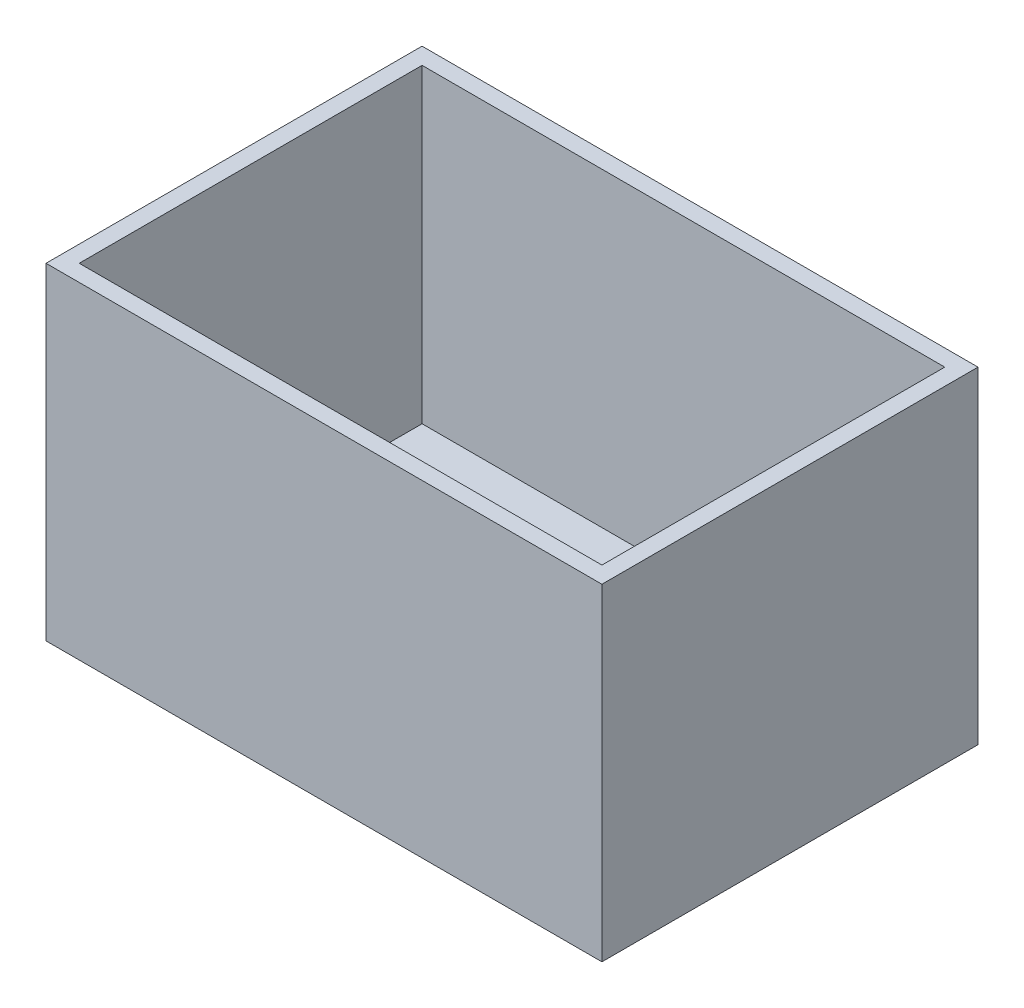
ISO-10303-21;
HEADER;
FILE_DESCRIPTION(('STEP AP214'),'2;1');
FILE_NAME('part.step','',(''),(''),'','','');
FILE_SCHEMA(('AUTOMOTIVE_DESIGN { 1 0 10303 214 1 1 1 1 }'));
ENDSEC;
DATA;
#1=APPLICATION_CONTEXT('core data for automotive mechanical design processes');
#2=APPLICATION_PROTOCOL_DEFINITION('international standard','automotive_design',2000,#1);
#3=PRODUCT_CONTEXT('',#1,'mechanical');
#4=PRODUCT('Part','Part','',(#3));
#5=PRODUCT_RELATED_PRODUCT_CATEGORY('part','',(#4));
#6=PRODUCT_DEFINITION_FORMATION('','',#4);
#7=PRODUCT_DEFINITION_CONTEXT('part definition',#1,'design');
#8=PRODUCT_DEFINITION('design','',#6,#7);
#9=PRODUCT_DEFINITION_SHAPE('','',#8);
#10=(LENGTH_UNIT() NAMED_UNIT(*) SI_UNIT(.MILLI.,.METRE.));
#11=(NAMED_UNIT(*) PLANE_ANGLE_UNIT() SI_UNIT($,.RADIAN.));
#12=(NAMED_UNIT(*) SI_UNIT($,.STERADIAN.) SOLID_ANGLE_UNIT());
#13=UNCERTAINTY_MEASURE_WITH_UNIT(LENGTH_MEASURE(1.E-05),#10,'distance_accuracy_value','');
#14=(GEOMETRIC_REPRESENTATION_CONTEXT(3) GLOBAL_UNCERTAINTY_ASSIGNED_CONTEXT((#13)) GLOBAL_UNIT_ASSIGNED_CONTEXT((#10,
#11,#12)) REPRESENTATION_CONTEXT('',''));
#15=CARTESIAN_POINT('',(0.,0.,0.));
#16=DIRECTION('',(0.,0.,1.));
#17=DIRECTION('',(1.,0.,0.));
#18=AXIS2_PLACEMENT_3D('',#15,#16,#17);
#19=CARTESIAN_POINT('',(0.,100.,0.));
#20=DIRECTION('',(0.,-1.,0.));
#21=DIRECTION('',(0.,0.,-1.));
#22=AXIS2_PLACEMENT_3D('',#19,#20,#21);
#23=PLANE('',#22);
#24=DIRECTION('',(0.,0.,-1.));
#25=VECTOR('',#24,1.);
#26=CARTESIAN_POINT('',(85.,100.,57.5));
#27=LINE('',#26,#25);
#28=CARTESIAN_POINT('',(85.,100.,57.5));
#29=VERTEX_POINT('',#28);
#30=CARTESIAN_POINT('',(85.,100.,-57.5));
#31=VERTEX_POINT('',#30);
#32=EDGE_CURVE('E157',#29,#31,#27,.T.);
#33=ORIENTED_EDGE('',*,*,#32,.T.);
#34=DIRECTION('',(-1.,0.,0.));
#35=VECTOR('',#34,1.);
#36=CARTESIAN_POINT('',(-85.,100.,-57.5));
#37=LINE('',#36,#35);
#38=CARTESIAN_POINT('',(-85.,100.,-57.5));
#39=VERTEX_POINT('',#38);
#40=EDGE_CURVE('E92',#31,#39,#37,.T.);
#41=ORIENTED_EDGE('',*,*,#40,.T.);
#42=DIRECTION('',(0.,0.,1.));
#43=VECTOR('',#42,1.);
#44=CARTESIAN_POINT('',(-85.,100.,57.5));
#45=LINE('',#44,#43);
#46=CARTESIAN_POINT('',(-85.,100.,57.5));
#47=VERTEX_POINT('',#46);
#48=EDGE_CURVE('E162',#39,#47,#45,.T.);
#49=ORIENTED_EDGE('',*,*,#48,.T.);
#50=DIRECTION('',(1.,0.,0.));
#51=VECTOR('',#50,1.);
#52=CARTESIAN_POINT('',(-85.,100.,57.5));
#53=LINE('',#52,#51);
#54=EDGE_CURVE('E64',#47,#29,#53,.T.);
#55=ORIENTED_EDGE('',*,*,#54,.T.);
#56=EDGE_LOOP('',(#33,#41,#49,#55));
#57=FACE_BOUND('',#56,.T.);
#58=DIRECTION('',(0.,0.,-1.));
#59=VECTOR('',#58,1.);
#60=CARTESIAN_POINT('',(79.92,100.,0.));
#61=LINE('',#60,#59);
#62=CARTESIAN_POINT('',(79.92,100.,52.42));
#63=VERTEX_POINT('',#62);
#64=CARTESIAN_POINT('',(79.92,100.,-52.42));
#65=VERTEX_POINT('',#64);
#66=EDGE_CURVE('E141',#63,#65,#61,.T.);
#67=ORIENTED_EDGE('',*,*,#66,.F.);
#68=DIRECTION('',(1.,0.,0.));
#69=VECTOR('',#68,1.);
#70=CARTESIAN_POINT('',(0.,100.,52.42));
#71=LINE('',#70,#69);
#72=CARTESIAN_POINT('',(-79.92,100.,52.42));
#73=VERTEX_POINT('',#72);
#74=EDGE_CURVE('E154',#73,#63,#71,.T.);
#75=ORIENTED_EDGE('',*,*,#74,.F.);
#76=DIRECTION('',(0.,0.,1.));
#77=VECTOR('',#76,1.);
#78=CARTESIAN_POINT('',(-79.92,100.,0.));
#79=LINE('',#78,#77);
#80=CARTESIAN_POINT('',(-79.92,100.,-52.42));
#81=VERTEX_POINT('',#80);
#82=EDGE_CURVE('E151',#81,#73,#79,.T.);
#83=ORIENTED_EDGE('',*,*,#82,.F.);
#84=DIRECTION('',(-1.,0.,0.));
#85=VECTOR('',#84,1.);
#86=CARTESIAN_POINT('',(0.,100.,-52.42));
#87=LINE('',#86,#85);
#88=EDGE_CURVE('E130',#65,#81,#87,.T.);
#89=ORIENTED_EDGE('',*,*,#88,.F.);
#90=EDGE_LOOP('',(#67,#75,#83,#89));
#91=FACE_BOUND('',#90,.T.);
#92=ADVANCED_FACE('F39',(#57,#91),#23,.F.);
#93=CARTESIAN_POINT('',(85.,100.,57.5));
#94=DIRECTION('',(-1.,0.,0.));
#95=DIRECTION('',(0.,0.,1.));
#96=AXIS2_PLACEMENT_3D('',#93,#94,#95);
#97=PLANE('',#96);
#98=DIRECTION('',(0.,0.,-1.));
#99=VECTOR('',#98,1.);
#100=CARTESIAN_POINT('',(85.,0.,57.5));
#101=LINE('',#100,#99);
#102=CARTESIAN_POINT('',(85.,0.,57.5));
#103=VERTEX_POINT('',#102);
#104=CARTESIAN_POINT('',(85.,0.,-57.5));
#105=VERTEX_POINT('',#104);
#106=EDGE_CURVE('E168',#103,#105,#101,.T.);
#107=ORIENTED_EDGE('',*,*,#106,.T.);
#108=DIRECTION('',(0.,-1.,0.));
#109=VECTOR('',#108,1.);
#110=CARTESIAN_POINT('',(85.,100.,-57.5));
#111=LINE('',#110,#109);
#112=EDGE_CURVE('E11',#31,#105,#111,.T.);
#113=ORIENTED_EDGE('',*,*,#112,.F.);
#114=ORIENTED_EDGE('',*,*,#32,.F.);
#115=DIRECTION('',(0.,-1.,0.));
#116=VECTOR('',#115,1.);
#117=CARTESIAN_POINT('',(85.,100.,57.5));
#118=LINE('',#117,#116);
#119=EDGE_CURVE('E167',#29,#103,#118,.T.);
#120=ORIENTED_EDGE('',*,*,#119,.T.);
#121=EDGE_LOOP('',(#107,#113,#114,#120));
#122=FACE_BOUND('',#121,.T.);
#123=ADVANCED_FACE('F41',(#122),#97,.F.);
#124=CARTESIAN_POINT('',(-85.,100.,-57.5));
#125=DIRECTION('',(0.,0.,1.));
#126=DIRECTION('',(1.,0.,0.));
#127=AXIS2_PLACEMENT_3D('',#124,#125,#126);
#128=PLANE('',#127);
#129=DIRECTION('',(-1.,0.,0.));
#130=VECTOR('',#129,1.);
#131=CARTESIAN_POINT('',(-85.,0.,-57.5));
#132=LINE('',#131,#130);
#133=CARTESIAN_POINT('',(-85.,0.,-57.5));
#134=VERTEX_POINT('',#133);
#135=EDGE_CURVE('E172',#105,#134,#132,.T.);
#136=ORIENTED_EDGE('',*,*,#135,.T.);
#137=DIRECTION('',(0.,-1.,0.));
#138=VECTOR('',#137,1.);
#139=CARTESIAN_POINT('',(-85.,100.,-57.5));
#140=LINE('',#139,#138);
#141=EDGE_CURVE('E48',#39,#134,#140,.T.);
#142=ORIENTED_EDGE('',*,*,#141,.F.);
#143=ORIENTED_EDGE('',*,*,#40,.F.);
#144=ORIENTED_EDGE('',*,*,#112,.T.);
#145=EDGE_LOOP('',(#136,#142,#143,#144));
#146=FACE_BOUND('',#145,.T.);
#147=ADVANCED_FACE('F206',(#146),#128,.F.);
#148=CARTESIAN_POINT('',(-85.,100.,57.5));
#149=DIRECTION('',(1.,0.,0.));
#150=DIRECTION('',(0.,0.,-1.));
#151=AXIS2_PLACEMENT_3D('',#148,#149,#150);
#152=PLANE('',#151);
#153=DIRECTION('',(0.,0.,1.));
#154=VECTOR('',#153,1.);
#155=CARTESIAN_POINT('',(-85.,0.,57.5));
#156=LINE('',#155,#154);
#157=CARTESIAN_POINT('',(-85.,0.,57.5));
#158=VERTEX_POINT('',#157);
#159=EDGE_CURVE('E175',#134,#158,#156,.T.);
#160=ORIENTED_EDGE('',*,*,#159,.T.);
#161=DIRECTION('',(0.,-1.,0.));
#162=VECTOR('',#161,1.);
#163=CARTESIAN_POINT('',(-85.,100.,57.5));
#164=LINE('',#163,#162);
#165=EDGE_CURVE('E182',#47,#158,#164,.T.);
#166=ORIENTED_EDGE('',*,*,#165,.F.);
#167=ORIENTED_EDGE('',*,*,#48,.F.);
#168=ORIENTED_EDGE('',*,*,#141,.T.);
#169=EDGE_LOOP('',(#160,#166,#167,#168));
#170=FACE_BOUND('',#169,.T.);
#171=ADVANCED_FACE('F189',(#170),#152,.F.);
#172=CARTESIAN_POINT('',(-85.,100.,57.5));
#173=DIRECTION('',(0.,0.,-1.));
#174=DIRECTION('',(-1.,0.,0.));
#175=AXIS2_PLACEMENT_3D('',#172,#173,#174);
#176=PLANE('',#175);
#177=DIRECTION('',(1.,0.,0.));
#178=VECTOR('',#177,1.);
#179=CARTESIAN_POINT('',(-85.,0.,57.5));
#180=LINE('',#179,#178);
#181=EDGE_CURVE('E85',#158,#103,#180,.T.);
#182=ORIENTED_EDGE('',*,*,#181,.T.);
#183=ORIENTED_EDGE('',*,*,#119,.F.);
#184=ORIENTED_EDGE('',*,*,#54,.F.);
#185=ORIENTED_EDGE('',*,*,#165,.T.);
#186=EDGE_LOOP('',(#182,#183,#184,#185));
#187=FACE_BOUND('',#186,.T.);
#188=ADVANCED_FACE('F197',(#187),#176,.F.);
#189=CARTESIAN_POINT('',(0.,0.,0.));
#190=DIRECTION('',(0.,-1.,0.));
#191=DIRECTION('',(0.,0.,-1.));
#192=AXIS2_PLACEMENT_3D('',#189,#190,#191);
#193=PLANE('',#192);
#194=ORIENTED_EDGE('',*,*,#106,.F.);
#195=ORIENTED_EDGE('',*,*,#181,.F.);
#196=ORIENTED_EDGE('',*,*,#159,.F.);
#197=ORIENTED_EDGE('',*,*,#135,.F.);
#198=EDGE_LOOP('',(#194,#195,#196,#197));
#199=FACE_BOUND('',#198,.T.);
#200=ADVANCED_FACE('F193',(#199),#193,.T.);
#201=CARTESIAN_POINT('',(79.92,100.,57.5));
#202=DIRECTION('',(-1.,0.,0.));
#203=DIRECTION('',(0.,0.,1.));
#204=AXIS2_PLACEMENT_3D('',#201,#202,#203);
#205=PLANE('',#204);
#206=DIRECTION('',(0.,0.,-1.));
#207=VECTOR('',#206,1.);
#208=CARTESIAN_POINT('',(79.92,5.08,0.));
#209=LINE('',#208,#207);
#210=CARTESIAN_POINT('',(79.92,5.08,52.42));
#211=VERTEX_POINT('',#210);
#212=CARTESIAN_POINT('',(79.92,5.08,-52.42));
#213=VERTEX_POINT('',#212);
#214=EDGE_CURVE('E120',#211,#213,#209,.T.);
#215=ORIENTED_EDGE('',*,*,#214,.F.);
#216=DIRECTION('',(0.,-1.,0.));
#217=VECTOR('',#216,1.);
#218=CARTESIAN_POINT('',(79.92,100.,52.42));
#219=LINE('',#218,#217);
#220=EDGE_CURVE('E145',#63,#211,#219,.T.);
#221=ORIENTED_EDGE('',*,*,#220,.F.);
#222=ORIENTED_EDGE('',*,*,#66,.T.);
#223=DIRECTION('',(0.,-1.,0.));
#224=VECTOR('',#223,1.);
#225=CARTESIAN_POINT('',(79.92,100.,-52.42));
#226=LINE('',#225,#224);
#227=EDGE_CURVE('E134',#65,#213,#226,.T.);
#228=ORIENTED_EDGE('',*,*,#227,.T.);
#229=EDGE_LOOP('',(#215,#221,#222,#228));
#230=FACE_BOUND('',#229,.T.);
#231=ADVANCED_FACE('F204',(#230),#205,.T.);
#232=CARTESIAN_POINT('',(-85.,100.,-52.42));
#233=DIRECTION('',(0.,0.,1.));
#234=DIRECTION('',(1.,0.,0.));
#235=AXIS2_PLACEMENT_3D('',#232,#233,#234);
#236=PLANE('',#235);
#237=DIRECTION('',(-1.,0.,0.));
#238=VECTOR('',#237,1.);
#239=CARTESIAN_POINT('',(0.,5.08,-52.42));
#240=LINE('',#239,#238);
#241=CARTESIAN_POINT('',(-79.92,5.08,-52.42));
#242=VERTEX_POINT('',#241);
#243=EDGE_CURVE('E114',#213,#242,#240,.T.);
#244=ORIENTED_EDGE('',*,*,#243,.F.);
#245=ORIENTED_EDGE('',*,*,#227,.F.);
#246=ORIENTED_EDGE('',*,*,#88,.T.);
#247=DIRECTION('',(0.,-1.,0.));
#248=VECTOR('',#247,1.);
#249=CARTESIAN_POINT('',(-79.92,100.,-52.42));
#250=LINE('',#249,#248);
#251=EDGE_CURVE('E127',#81,#242,#250,.T.);
#252=ORIENTED_EDGE('',*,*,#251,.T.);
#253=EDGE_LOOP('',(#244,#245,#246,#252));
#254=FACE_BOUND('',#253,.T.);
#255=ADVANCED_FACE('F128',(#254),#236,.T.);
#256=CARTESIAN_POINT('',(-79.92,100.,57.5));
#257=DIRECTION('',(1.,0.,0.));
#258=DIRECTION('',(0.,0.,-1.));
#259=AXIS2_PLACEMENT_3D('',#256,#257,#258);
#260=PLANE('',#259);
#261=DIRECTION('',(0.,0.,1.));
#262=VECTOR('',#261,1.);
#263=CARTESIAN_POINT('',(-79.92,5.08,0.));
#264=LINE('',#263,#262);
#265=CARTESIAN_POINT('',(-79.92,5.08,52.42));
#266=VERTEX_POINT('',#265);
#267=EDGE_CURVE('E118',#242,#266,#264,.T.);
#268=ORIENTED_EDGE('',*,*,#267,.F.);
#269=ORIENTED_EDGE('',*,*,#251,.F.);
#270=ORIENTED_EDGE('',*,*,#82,.T.);
#271=DIRECTION('',(0.,-1.,0.));
#272=VECTOR('',#271,1.);
#273=CARTESIAN_POINT('',(-79.92,100.,52.42));
#274=LINE('',#273,#272);
#275=EDGE_CURVE('E55',#73,#266,#274,.T.);
#276=ORIENTED_EDGE('',*,*,#275,.T.);
#277=EDGE_LOOP('',(#268,#269,#270,#276));
#278=FACE_BOUND('',#277,.T.);
#279=ADVANCED_FACE('F136',(#278),#260,.T.);
#280=CARTESIAN_POINT('',(-85.,100.,52.42));
#281=DIRECTION('',(0.,0.,-1.));
#282=DIRECTION('',(-1.,0.,0.));
#283=AXIS2_PLACEMENT_3D('',#280,#281,#282);
#284=PLANE('',#283);
#285=DIRECTION('',(1.,0.,0.));
#286=VECTOR('',#285,1.);
#287=CARTESIAN_POINT('',(0.,5.08,52.42));
#288=LINE('',#287,#286);
#289=EDGE_CURVE('E138',#266,#211,#288,.T.);
#290=ORIENTED_EDGE('',*,*,#289,.F.);
#291=ORIENTED_EDGE('',*,*,#275,.F.);
#292=ORIENTED_EDGE('',*,*,#74,.T.);
#293=ORIENTED_EDGE('',*,*,#220,.T.);
#294=EDGE_LOOP('',(#290,#291,#292,#293));
#295=FACE_BOUND('',#294,.T.);
#296=ADVANCED_FACE('F217',(#295),#284,.T.);
#297=CARTESIAN_POINT('',(0.,5.08,0.));
#298=DIRECTION('',(0.,-1.,0.));
#299=DIRECTION('',(0.,0.,-1.));
#300=AXIS2_PLACEMENT_3D('',#297,#298,#299);
#301=PLANE('',#300);
#302=ORIENTED_EDGE('',*,*,#214,.T.);
#303=ORIENTED_EDGE('',*,*,#243,.T.);
#304=ORIENTED_EDGE('',*,*,#267,.T.);
#305=ORIENTED_EDGE('',*,*,#289,.T.);
#306=EDGE_LOOP('',(#302,#303,#304,#305));
#307=FACE_BOUND('',#306,.T.);
#308=ADVANCED_FACE('F116',(#307),#301,.F.);
#309=CLOSED_SHELL('',(#92,#123,#147,#171,#188,#200,#231,#255,#279,#296,#308));
#310=MANIFOLD_SOLID_BREP('B2',#309);
#311=ADVANCED_BREP_SHAPE_REPRESENTATION('',(#18,#310),#14);
#312=SHAPE_DEFINITION_REPRESENTATION(#9,#311);
ENDSEC;
END-ISO-10303-21;
